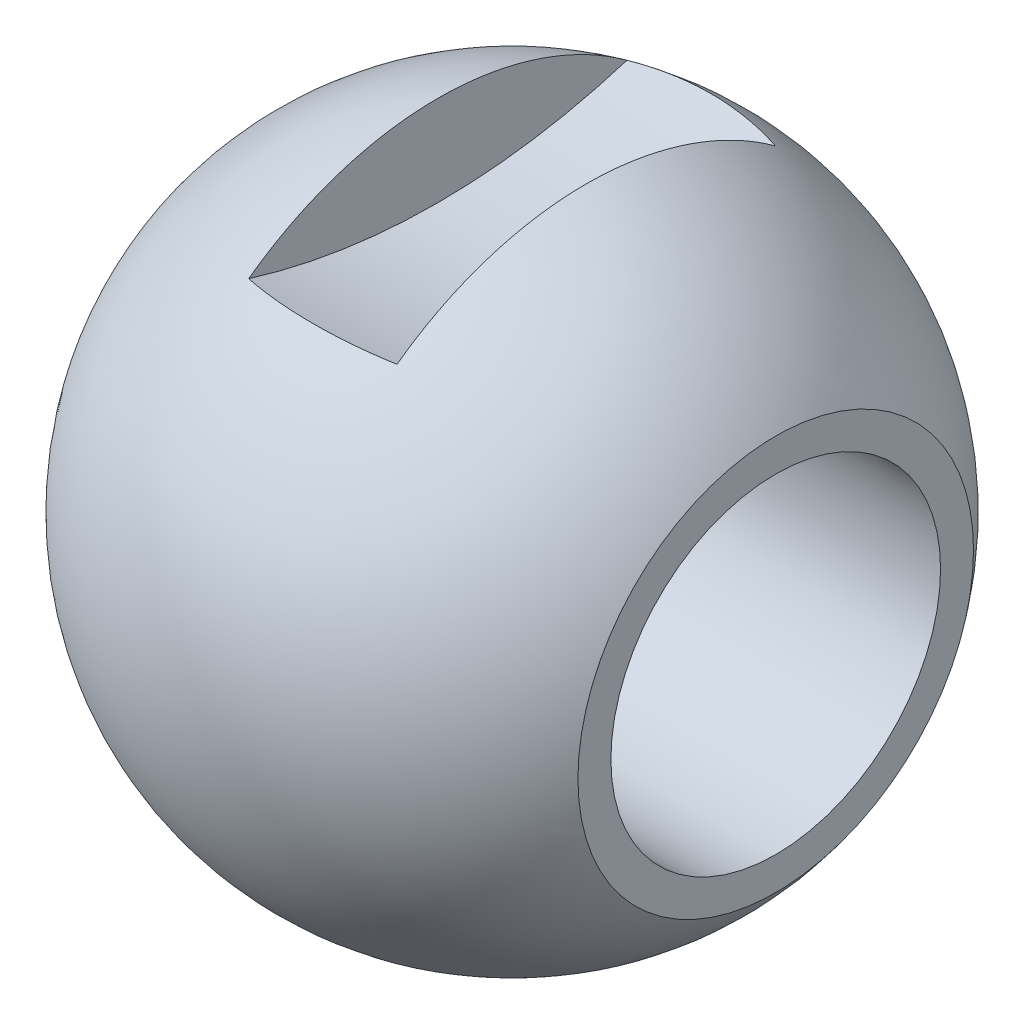
ISO-10303-21;
HEADER;
FILE_DESCRIPTION(('STEP AP214'),'2;1');
FILE_NAME('part.step','',(''),(''),'','','');
FILE_SCHEMA(('AUTOMOTIVE_DESIGN { 1 0 10303 214 1 1 1 1 }'));
ENDSEC;
DATA;
#1=APPLICATION_CONTEXT('core data for automotive mechanical design processes');
#2=APPLICATION_PROTOCOL_DEFINITION('international standard','automotive_design',2000,#1);
#3=PRODUCT_CONTEXT('',#1,'mechanical');
#4=PRODUCT('Part','Part','',(#3));
#5=PRODUCT_RELATED_PRODUCT_CATEGORY('part','',(#4));
#6=PRODUCT_DEFINITION_FORMATION('','',#4);
#7=PRODUCT_DEFINITION_CONTEXT('part definition',#1,'design');
#8=PRODUCT_DEFINITION('design','',#6,#7);
#9=PRODUCT_DEFINITION_SHAPE('','',#8);
#10=(LENGTH_UNIT() NAMED_UNIT(*) SI_UNIT(.MILLI.,.METRE.));
#11=(NAMED_UNIT(*) PLANE_ANGLE_UNIT() SI_UNIT($,.RADIAN.));
#12=(NAMED_UNIT(*) SI_UNIT($,.STERADIAN.) SOLID_ANGLE_UNIT());
#13=UNCERTAINTY_MEASURE_WITH_UNIT(LENGTH_MEASURE(1.E-05),#10,'distance_accuracy_value','');
#14=(GEOMETRIC_REPRESENTATION_CONTEXT(3) GLOBAL_UNCERTAINTY_ASSIGNED_CONTEXT((#13)) GLOBAL_UNIT_ASSIGNED_CONTEXT((#10,
#11,#12)) REPRESENTATION_CONTEXT('',''));
#15=CARTESIAN_POINT('',(0.,0.,0.));
#16=DIRECTION('',(0.,0.,1.));
#17=DIRECTION('',(1.,0.,0.));
#18=AXIS2_PLACEMENT_3D('',#15,#16,#17);
#19=CARTESIAN_POINT('',(0.,0.,0.));
#20=DIRECTION('',(0.,-1.,0.));
#21=DIRECTION('',(-1.,0.,0.));
#22=AXIS2_PLACEMENT_3D('',#19,#20,#21);
#23=SPHERICAL_SURFACE('',#22,20.);
#24=CARTESIAN_POINT('',(-16.,0.,0.));
#25=DIRECTION('',(-1.,0.,0.));
#26=DIRECTION('',(0.,0.,1.));
#27=AXIS2_PLACEMENT_3D('',#24,#25,#26);
#28=CIRCLE('',#27,12.);
#29=CARTESIAN_POINT('',(-16.,0.,12.));
#30=VERTEX_POINT('',#29);
#31=EDGE_CURVE('E98',#30,#30,#28,.F.);
#32=ORIENTED_EDGE('',*,*,#31,.T.);
#33=EDGE_LOOP('',(#32));
#34=FACE_BOUND('',#33,.T.);
#35=CARTESIAN_POINT('',(16.,0.,0.));
#36=DIRECTION('',(1.,0.,0.));
#37=DIRECTION('',(0.,0.,-1.));
#38=AXIS2_PLACEMENT_3D('',#35,#36,#37);
#39=CIRCLE('',#38,12.);
#40=CARTESIAN_POINT('',(16.,0.,-12.));
#41=VERTEX_POINT('',#40);
#42=EDGE_CURVE('E52',#41,#41,#39,.F.);
#43=ORIENTED_EDGE('',*,*,#42,.T.);
#44=EDGE_LOOP('',(#43));
#45=FACE_BOUND('',#44,.T.);
#46=CARTESIAN_POINT('',(-4.5002,15.7499828567619,11.475462516679));
#47=CARTESIAN_POINT('',(-4.2776510996064,15.7690614482609,11.5365516862826));
#48=CARTESIAN_POINT('',(-4.05373764863892,15.7868371919558,11.5929539217883));
#49=CARTESIAN_POINT('',(-3.60357306629021,15.8196656300409,11.6964121489988));
#50=CARTESIAN_POINT('',(-3.37732202866627,15.8347184331995,11.7434685140342));
#51=CARTESIAN_POINT('',(-2.69568559756492,15.8756147828218,11.8706552701798));
#52=CARTESIAN_POINT('',(-2.23735513389685,15.8972016095399,11.9368201981431));
#53=CARTESIAN_POINT('',(-1.32698798162537,15.9280153672432,12.0308899911344));
#54=CARTESIAN_POINT('',(-0.875045330553025,15.9375123182108,12.0596310432471));
#55=CARTESIAN_POINT('',(0.0296344118784178,15.9447985405741,12.0816931684283));
#56=CARTESIAN_POINT('',(0.482371266928149,15.9425908462678,12.0750234213483));
#57=CARTESIAN_POINT('',(1.5325891265368,15.9238903131316,12.0183094673341));
#58=CARTESIAN_POINT('',(2.12935932595473,15.9029938142153,11.9548907469874));
#59=CARTESIAN_POINT('',(3.02049525933377,15.8568292914725,11.812298184806));
#60=CARTESIAN_POINT('',(3.31914187454231,15.8387743334013,11.7562397447268));
#61=CARTESIAN_POINT('',(3.91270251938123,15.7978943651857,11.6279775887589));
#62=CARTESIAN_POINT('',(4.2076154920092,15.7750680349252,11.5557694042632));
#63=CARTESIAN_POINT('',(4.5002,15.7499828567619,11.4754625166791));
#64=B_SPLINE_CURVE_WITH_KNOTS('',3,(#46,#47,#48,#49,#50,#51,#52,#53,#54,#55,#56,#57,#58,#59,#60,
#61,#62,#63),.UNSPECIFIED.,.F.,.F.,(4,2,2,2,2,2,2,2,4),(0.,0.694587470186828,1.38914718877237,
2.77807455502979,4.13540322721072,5.49238004438647,7.28975934164121,8.20254077099446,
9.11557507858591),.UNSPECIFIED.);
#65=CARTESIAN_POINT('',(-4.5,15.75,11.4755174175285));
#66=VERTEX_POINT('',#65);
#67=CARTESIAN_POINT('',(4.5,15.75,11.4755174175285));
#68=VERTEX_POINT('',#67);
#69=EDGE_CURVE('E51',#66,#68,#64,.T.);
#70=ORIENTED_EDGE('',*,*,#69,.F.);
#71=CARTESIAN_POINT('',(-4.5,0.,0.));
#72=DIRECTION('',(1.,0.,0.));
#73=DIRECTION('',(0.,0.,-1.));
#74=AXIS2_PLACEMENT_3D('',#71,#72,#73);
#75=CIRCLE('',#74,19.487175269905);
#76=CARTESIAN_POINT('',(-4.5,15.75,-11.4755174175285));
#77=VERTEX_POINT('',#76);
#78=EDGE_CURVE('E11',#66,#77,#75,.F.);
#79=ORIENTED_EDGE('',*,*,#78,.T.);
#80=CARTESIAN_POINT('',(4.50019999999986,15.7499828567619,-11.4754625166791));
#81=CARTESIAN_POINT('',(4.27765109960626,15.7690614482609,-11.5365516862826));
#82=CARTESIAN_POINT('',(4.05373764863878,15.7868371919558,-11.5929539217883));
#83=CARTESIAN_POINT('',(3.60357306629006,15.8196656300409,-11.6964121489989));
#84=CARTESIAN_POINT('',(3.37732202866613,15.8347184331995,-11.7434685140342));
#85=CARTESIAN_POINT('',(2.69568559756477,15.8756147828218,-11.8706552701798));
#86=CARTESIAN_POINT('',(2.23735513389671,15.8972016095399,-11.9368201981431));
#87=CARTESIAN_POINT('',(1.32698798162522,15.9280153672432,-12.0308899911344));
#88=CARTESIAN_POINT('',(0.875045330552874,15.9375123182108,-12.0596310432471));
#89=CARTESIAN_POINT('',(-0.0296344118785697,15.9447985405741,-12.0816931684283));
#90=CARTESIAN_POINT('',(-0.482371266928301,15.9425908462678,-12.0750234213483));
#91=CARTESIAN_POINT('',(-1.53258912653691,15.9238903131316,-12.018309467334));
#92=CARTESIAN_POINT('',(-2.12935932595478,15.9029938142153,-11.9548907469874));
#93=CARTESIAN_POINT('',(-3.02049525933376,15.8568292914725,-11.812298184806));
#94=CARTESIAN_POINT('',(-3.31914187454227,15.8387743334013,-11.7562397447268));
#95=CARTESIAN_POINT('',(-3.91270251938114,15.7978943651857,-11.627977588759));
#96=CARTESIAN_POINT('',(-4.20761549200909,15.7750680349252,-11.5557694042632));
#97=CARTESIAN_POINT('',(-4.50019999999986,15.7499828567619,-11.4754625166791));
#98=B_SPLINE_CURVE_WITH_KNOTS('',3,(#80,#81,#82,#83,#84,#85,#86,#87,#88,#89,#90,#91,#92,#93,#94,
#95,#96,#97),.UNSPECIFIED.,.F.,.F.,(4,2,2,2,2,2,2,2,4),(0.,0.694587470186827,1.38914718877237,
2.77807455502979,4.13540322721073,5.49238004438648,7.28975934164107,8.20254077099425,
9.11557507858561),.UNSPECIFIED.);
#99=CARTESIAN_POINT('',(4.5,15.75,-11.4755174175285));
#100=VERTEX_POINT('',#99);
#101=EDGE_CURVE('E25',#100,#77,#98,.T.);
#102=ORIENTED_EDGE('',*,*,#101,.F.);
#103=CARTESIAN_POINT('',(4.5,0.,0.));
#104=DIRECTION('',(1.,0.,0.));
#105=DIRECTION('',(0.,0.,-1.));
#106=AXIS2_PLACEMENT_3D('',#103,#104,#105);
#107=CIRCLE('',#106,19.487175269905);
#108=EDGE_CURVE('E46',#68,#100,#107,.F.);
#109=ORIENTED_EDGE('',*,*,#108,.F.);
#110=EDGE_LOOP('',(#70,#79,#102,#109));
#111=FACE_BOUND('',#110,.T.);
#112=ADVANCED_FACE('F16',(#34,#45,#111),#23,.T.);
#113=CARTESIAN_POINT('',(-16.,-24.6591675126903,-20.));
#114=DIRECTION('',(-1.,0.,0.));
#115=DIRECTION('',(0.,0.,1.));
#116=AXIS2_PLACEMENT_3D('',#113,#114,#115);
#117=PLANE('',#116);
#118=CARTESIAN_POINT('',(-16.,0.,0.));
#119=DIRECTION('',(-1.,0.,0.));
#120=DIRECTION('',(0.,0.,1.));
#121=AXIS2_PLACEMENT_3D('',#118,#119,#120);
#122=CIRCLE('',#121,10.);
#123=CARTESIAN_POINT('',(-16.,0.,10.));
#124=VERTEX_POINT('',#123);
#125=EDGE_CURVE('E107',#124,#124,#122,.T.);
#126=ORIENTED_EDGE('',*,*,#125,.F.);
#127=EDGE_LOOP('',(#126));
#128=FACE_BOUND('',#127,.T.);
#129=ORIENTED_EDGE('',*,*,#31,.F.);
#130=EDGE_LOOP('',(#129));
#131=FACE_BOUND('',#130,.T.);
#132=ADVANCED_FACE('F79',(#128,#131),#117,.T.);
#133=CARTESIAN_POINT('',(16.,-24.6591675126903,-20.));
#134=DIRECTION('',(1.,0.,0.));
#135=DIRECTION('',(0.,0.,-1.));
#136=AXIS2_PLACEMENT_3D('',#133,#134,#135);
#137=PLANE('',#136);
#138=CARTESIAN_POINT('',(16.,0.,0.));
#139=DIRECTION('',(-1.,0.,0.));
#140=DIRECTION('',(0.,0.,1.));
#141=AXIS2_PLACEMENT_3D('',#138,#139,#140);
#142=CIRCLE('',#141,10.);
#143=CARTESIAN_POINT('',(16.,0.,10.));
#144=VERTEX_POINT('',#143);
#145=EDGE_CURVE('E57',#144,#144,#142,.T.);
#146=ORIENTED_EDGE('',*,*,#145,.T.);
#147=EDGE_LOOP('',(#146));
#148=FACE_BOUND('',#147,.T.);
#149=ORIENTED_EDGE('',*,*,#42,.F.);
#150=EDGE_LOOP('',(#149));
#151=FACE_BOUND('',#150,.T.);
#152=ADVANCED_FACE('F77',(#148,#151),#137,.T.);
#153=CARTESIAN_POINT('',(-4.5,52.5,0.));
#154=DIRECTION('',(1.,0.,0.));
#155=DIRECTION('',(0.,0.,-1.));
#156=AXIS2_PLACEMENT_3D('',#153,#154,#155);
#157=CYLINDRICAL_SURFACE('',#156,38.5);
#158=ORIENTED_EDGE('',*,*,#101,.T.);
#159=CARTESIAN_POINT('',(-4.5,52.5,0.));
#160=DIRECTION('',(1.,0.,0.));
#161=DIRECTION('',(0.,0.,-1.));
#162=AXIS2_PLACEMENT_3D('',#159,#160,#161);
#163=CIRCLE('',#162,38.5);
#164=EDGE_CURVE('E56',#66,#77,#163,.T.);
#165=ORIENTED_EDGE('',*,*,#164,.F.);
#166=ORIENTED_EDGE('',*,*,#69,.T.);
#167=CARTESIAN_POINT('',(4.5,52.5,0.));
#168=DIRECTION('',(1.,0.,0.));
#169=DIRECTION('',(0.,0.,-1.));
#170=AXIS2_PLACEMENT_3D('',#167,#168,#169);
#171=CIRCLE('',#170,38.5);
#172=EDGE_CURVE('E31',#68,#100,#171,.T.);
#173=ORIENTED_EDGE('',*,*,#172,.T.);
#174=EDGE_LOOP('',(#158,#165,#166,#173));
#175=FACE_BOUND('',#174,.T.);
#176=ADVANCED_FACE('F54',(#175),#157,.F.);
#177=CARTESIAN_POINT('',(-4.5,52.5,0.));
#178=DIRECTION('',(1.,0.,0.));
#179=DIRECTION('',(0.,0.,-1.));
#180=AXIS2_PLACEMENT_3D('',#177,#178,#179);
#181=PLANE('',#180);
#182=ORIENTED_EDGE('',*,*,#164,.T.);
#183=ORIENTED_EDGE('',*,*,#78,.F.);
#184=EDGE_LOOP('',(#182,#183));
#185=FACE_BOUND('',#184,.T.);
#186=ADVANCED_FACE('F76',(#185),#181,.T.);
#187=CARTESIAN_POINT('',(4.5,52.5,0.));
#188=DIRECTION('',(1.,0.,0.));
#189=DIRECTION('',(0.,0.,-1.));
#190=AXIS2_PLACEMENT_3D('',#187,#188,#189);
#191=PLANE('',#190);
#192=ORIENTED_EDGE('',*,*,#108,.T.);
#193=ORIENTED_EDGE('',*,*,#172,.F.);
#194=EDGE_LOOP('',(#192,#193));
#195=FACE_BOUND('',#194,.T.);
#196=ADVANCED_FACE('F47',(#195),#191,.F.);
#197=CARTESIAN_POINT('',(16.,0.,0.));
#198=DIRECTION('',(-1.,0.,0.));
#199=DIRECTION('',(0.,0.,1.));
#200=AXIS2_PLACEMENT_3D('',#197,#198,#199);
#201=CYLINDRICAL_SURFACE('',#200,10.);
#202=ORIENTED_EDGE('',*,*,#145,.F.);
#203=EDGE_LOOP('',(#202));
#204=FACE_BOUND('',#203,.T.);
#205=ORIENTED_EDGE('',*,*,#125,.T.);
#206=EDGE_LOOP('',(#205));
#207=FACE_BOUND('',#206,.T.);
#208=ADVANCED_FACE('F113',(#204,#207),#201,.F.);
#209=CLOSED_SHELL('',(#112,#132,#152,#176,#186,#196,#208));
#210=MANIFOLD_SOLID_BREP('B1',#209);
#211=ADVANCED_BREP_SHAPE_REPRESENTATION('',(#18,#210),#14);
#212=SHAPE_DEFINITION_REPRESENTATION(#9,#211);
ENDSEC;
END-ISO-10303-21;
